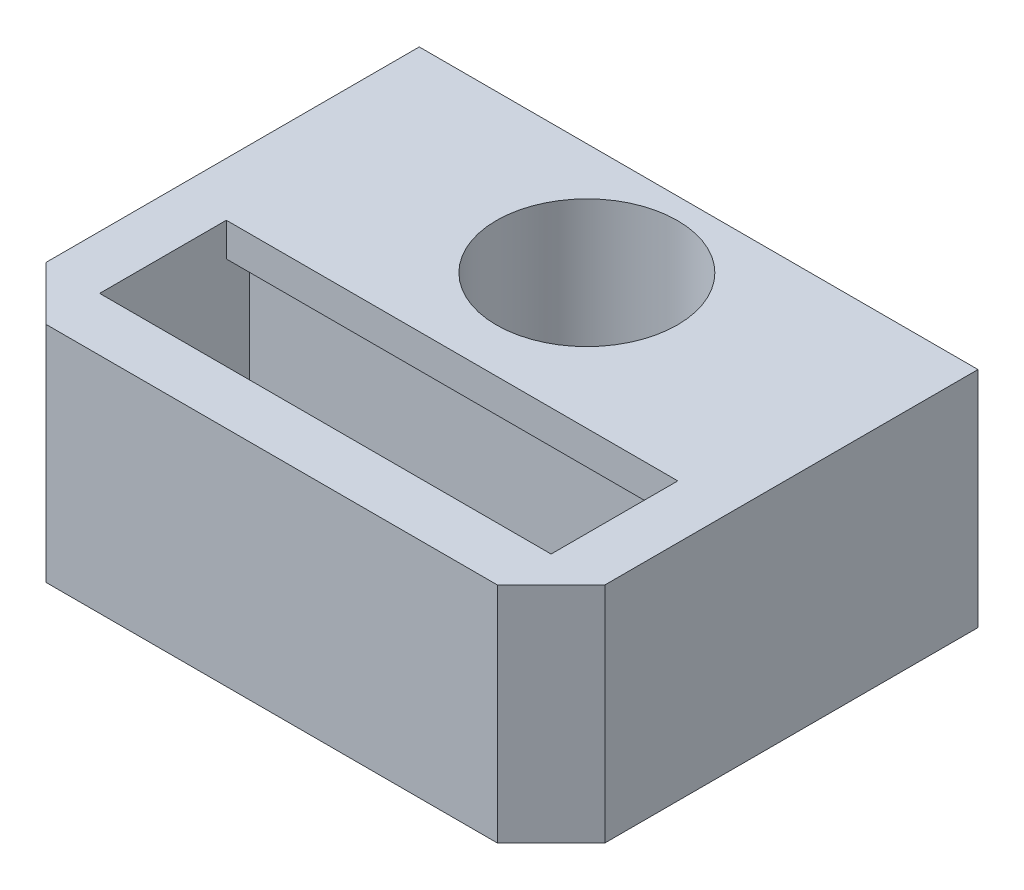
ISO-10303-21;
HEADER;
FILE_DESCRIPTION(('STEP AP214'),'2;1');
FILE_NAME('part.step','',(''),(''),'','','');
FILE_SCHEMA(('AUTOMOTIVE_DESIGN { 1 0 10303 214 1 1 1 1 }'));
ENDSEC;
DATA;
#1=APPLICATION_CONTEXT('core data for automotive mechanical design processes');
#2=APPLICATION_PROTOCOL_DEFINITION('international standard','automotive_design',2000,#1);
#3=PRODUCT_CONTEXT('',#1,'mechanical');
#4=PRODUCT('Part','Part','',(#3));
#5=PRODUCT_RELATED_PRODUCT_CATEGORY('part','',(#4));
#6=PRODUCT_DEFINITION_FORMATION('','',#4);
#7=PRODUCT_DEFINITION_CONTEXT('part definition',#1,'design');
#8=PRODUCT_DEFINITION('design','',#6,#7);
#9=PRODUCT_DEFINITION_SHAPE('','',#8);
#10=(LENGTH_UNIT() NAMED_UNIT(*) SI_UNIT(.MILLI.,.METRE.));
#11=(NAMED_UNIT(*) PLANE_ANGLE_UNIT() SI_UNIT($,.RADIAN.));
#12=(NAMED_UNIT(*) SI_UNIT($,.STERADIAN.) SOLID_ANGLE_UNIT());
#13=UNCERTAINTY_MEASURE_WITH_UNIT(LENGTH_MEASURE(1.E-05),#10,'distance_accuracy_value','');
#14=(GEOMETRIC_REPRESENTATION_CONTEXT(3) GLOBAL_UNCERTAINTY_ASSIGNED_CONTEXT((#13)) GLOBAL_UNIT_ASSIGNED_CONTEXT((#10,
#11,#12)) REPRESENTATION_CONTEXT('',''));
#15=CARTESIAN_POINT('',(0.,0.,0.));
#16=DIRECTION('',(0.,0.,1.));
#17=DIRECTION('',(1.,0.,0.));
#18=AXIS2_PLACEMENT_3D('',#15,#16,#17);
#19=CARTESIAN_POINT('',(0.,10.,0.));
#20=DIRECTION('',(0.,-1.,0.));
#21=DIRECTION('',(0.,0.,-1.));
#22=AXIS2_PLACEMENT_3D('',#19,#20,#21);
#23=PLANE('',#22);
#24=DIRECTION('',(-1.,0.,0.));
#25=VECTOR('',#24,1.);
#26=CARTESIAN_POINT('',(12.5,10.,6.03119465197785));
#27=LINE('',#26,#25);
#28=CARTESIAN_POINT('',(10.1,10.,6.03119465197785));
#29=VERTEX_POINT('',#28);
#30=CARTESIAN_POINT('',(-10.1,10.,6.03119465197785));
#31=VERTEX_POINT('',#30);
#32=EDGE_CURVE('E145',#29,#31,#27,.T.);
#33=ORIENTED_EDGE('',*,*,#32,.F.);
#34=DIRECTION('',(0.,0.,-1.));
#35=VECTOR('',#34,1.);
#36=CARTESIAN_POINT('',(10.1,10.,5.));
#37=LINE('',#36,#35);
#38=CARTESIAN_POINT('',(10.1,10.,11.7));
#39=VERTEX_POINT('',#38);
#40=EDGE_CURVE('E246',#39,#29,#37,.T.);
#41=ORIENTED_EDGE('',*,*,#40,.F.);
#42=DIRECTION('',(1.,0.,0.));
#43=VECTOR('',#42,1.);
#44=CARTESIAN_POINT('',(-10.1,10.,11.7));
#45=LINE('',#44,#43);
#46=CARTESIAN_POINT('',(-10.1,10.,11.7));
#47=VERTEX_POINT('',#46);
#48=EDGE_CURVE('E249',#47,#39,#45,.T.);
#49=ORIENTED_EDGE('',*,*,#48,.F.);
#50=DIRECTION('',(0.,0.,1.));
#51=VECTOR('',#50,1.);
#52=CARTESIAN_POINT('',(-10.1,10.,5.));
#53=LINE('',#52,#51);
#54=EDGE_CURVE('E216',#31,#47,#53,.T.);
#55=ORIENTED_EDGE('',*,*,#54,.F.);
#56=EDGE_LOOP('',(#33,#41,#49,#55));
#57=FACE_BOUND('',#56,.T.);
#58=DIRECTION('',(0.,0.,-1.));
#59=VECTOR('',#58,1.);
#60=CARTESIAN_POINT('',(12.5,10.,5.));
#61=LINE('',#60,#59);
#62=CARTESIAN_POINT('',(12.5,10.,11.7));
#63=VERTEX_POINT('',#62);
#64=CARTESIAN_POINT('',(12.5,10.,-5.));
#65=VERTEX_POINT('',#64);
#66=EDGE_CURVE('E165',#63,#65,#61,.T.);
#67=ORIENTED_EDGE('',*,*,#66,.T.);
#68=DIRECTION('',(-1.,0.,0.));
#69=VECTOR('',#68,1.);
#70=CARTESIAN_POINT('',(-12.5,10.,-5.));
#71=LINE('',#70,#69);
#72=CARTESIAN_POINT('',(-12.5,10.,-5.));
#73=VERTEX_POINT('',#72);
#74=EDGE_CURVE('E179',#65,#73,#71,.T.);
#75=ORIENTED_EDGE('',*,*,#74,.T.);
#76=DIRECTION('',(0.,0.,1.));
#77=VECTOR('',#76,1.);
#78=CARTESIAN_POINT('',(-12.5,10.,5.));
#79=LINE('',#78,#77);
#80=CARTESIAN_POINT('',(-12.5,10.,11.7));
#81=VERTEX_POINT('',#80);
#82=EDGE_CURVE('E161',#73,#81,#79,.T.);
#83=ORIENTED_EDGE('',*,*,#82,.T.);
#84=DIRECTION('',(-0.707106781186546,0.,-0.707106781186549));
#85=VECTOR('',#84,1.);
#86=CARTESIAN_POINT('',(-12.5,10.,11.7));
#87=LINE('',#86,#85);
#88=CARTESIAN_POINT('',(-10.1,10.,14.1));
#89=VERTEX_POINT('',#88);
#90=EDGE_CURVE('E137',#89,#81,#87,.T.);
#91=ORIENTED_EDGE('',*,*,#90,.F.);
#92=DIRECTION('',(-1.,0.,0.));
#93=VECTOR('',#92,1.);
#94=CARTESIAN_POINT('',(-10.1,10.,14.1));
#95=LINE('',#94,#93);
#96=CARTESIAN_POINT('',(10.1,10.,14.1));
#97=VERTEX_POINT('',#96);
#98=EDGE_CURVE('E238',#97,#89,#95,.T.);
#99=ORIENTED_EDGE('',*,*,#98,.F.);
#100=DIRECTION('',(-0.707106781186546,0.,0.707106781186549));
#101=VECTOR('',#100,1.);
#102=CARTESIAN_POINT('',(10.1,10.,14.1));
#103=LINE('',#102,#101);
#104=EDGE_CURVE('E242',#63,#97,#103,.T.);
#105=ORIENTED_EDGE('',*,*,#104,.F.);
#106=EDGE_LOOP('',(#67,#75,#83,#91,#99,#105));
#107=FACE_BOUND('',#106,.T.);
#108=CARTESIAN_POINT('',(0.,10.,0.));
#109=DIRECTION('',(0.,1.,0.));
#110=DIRECTION('',(0.,0.,1.));
#111=AXIS2_PLACEMENT_3D('',#108,#109,#110);
#112=CIRCLE('',#111,4.05);
#113=CARTESIAN_POINT('',(0.,10.,4.05));
#114=VERTEX_POINT('',#113);
#115=EDGE_CURVE('E176',#114,#114,#112,.T.);
#116=ORIENTED_EDGE('',*,*,#115,.F.);
#117=EDGE_LOOP('',(#116));
#118=FACE_BOUND('',#117,.T.);
#119=ADVANCED_FACE('F39',(#57,#107,#118),#23,.F.);
#120=CARTESIAN_POINT('',(0.,0.,0.));
#121=DIRECTION('',(0.,-1.,0.));
#122=DIRECTION('',(0.,0.,-1.));
#123=AXIS2_PLACEMENT_3D('',#120,#121,#122);
#124=PLANE('',#123);
#125=DIRECTION('',(0.,0.,-1.));
#126=VECTOR('',#125,1.);
#127=CARTESIAN_POINT('',(12.5,0.,5.));
#128=LINE('',#127,#126);
#129=CARTESIAN_POINT('',(12.5,0.,11.7));
#130=VERTEX_POINT('',#129);
#131=CARTESIAN_POINT('',(12.5,0.,-5.));
#132=VERTEX_POINT('',#131);
#133=EDGE_CURVE('E172',#130,#132,#128,.T.);
#134=ORIENTED_EDGE('',*,*,#133,.F.);
#135=DIRECTION('',(-0.707106781186546,0.,0.707106781186549));
#136=VECTOR('',#135,1.);
#137=CARTESIAN_POINT('',(10.1,0.,14.1));
#138=LINE('',#137,#136);
#139=CARTESIAN_POINT('',(10.1,0.,14.1));
#140=VERTEX_POINT('',#139);
#141=EDGE_CURVE('E221',#130,#140,#138,.T.);
#142=ORIENTED_EDGE('',*,*,#141,.T.);
#143=DIRECTION('',(-1.,0.,0.));
#144=VECTOR('',#143,1.);
#145=CARTESIAN_POINT('',(-10.1,0.,14.1));
#146=LINE('',#145,#144);
#147=CARTESIAN_POINT('',(-10.1,0.,14.1));
#148=VERTEX_POINT('',#147);
#149=EDGE_CURVE('E217',#140,#148,#146,.T.);
#150=ORIENTED_EDGE('',*,*,#149,.T.);
#151=DIRECTION('',(-0.707106781186546,0.,-0.707106781186549));
#152=VECTOR('',#151,1.);
#153=CARTESIAN_POINT('',(-12.5,0.,11.7));
#154=LINE('',#153,#152);
#155=CARTESIAN_POINT('',(-12.5,0.,11.7));
#156=VERTEX_POINT('',#155);
#157=EDGE_CURVE('E212',#148,#156,#154,.T.);
#158=ORIENTED_EDGE('',*,*,#157,.T.);
#159=DIRECTION('',(0.,0.,1.));
#160=VECTOR('',#159,1.);
#161=CARTESIAN_POINT('',(-12.5,0.,5.));
#162=LINE('',#161,#160);
#163=CARTESIAN_POINT('',(-12.5,0.,-5.));
#164=VERTEX_POINT('',#163);
#165=EDGE_CURVE('E166',#164,#156,#162,.T.);
#166=ORIENTED_EDGE('',*,*,#165,.F.);
#167=DIRECTION('',(-1.,0.,0.));
#168=VECTOR('',#167,1.);
#169=CARTESIAN_POINT('',(-12.5,0.,-5.));
#170=LINE('',#169,#168);
#171=EDGE_CURVE('E169',#132,#164,#170,.T.);
#172=ORIENTED_EDGE('',*,*,#171,.F.);
#173=EDGE_LOOP('',(#134,#142,#150,#158,#166,#172));
#174=FACE_BOUND('',#173,.T.);
#175=DIRECTION('',(0.,0.,-1.));
#176=VECTOR('',#175,1.);
#177=CARTESIAN_POINT('',(10.1,0.,5.));
#178=LINE('',#177,#176);
#179=CARTESIAN_POINT('',(10.1,0.,11.7));
#180=VERTEX_POINT('',#179);
#181=CARTESIAN_POINT('',(10.1,0.,5.));
#182=VERTEX_POINT('',#181);
#183=EDGE_CURVE('E225',#180,#182,#178,.T.);
#184=ORIENTED_EDGE('',*,*,#183,.T.);
#185=DIRECTION('',(1.,0.,0.));
#186=VECTOR('',#185,1.);
#187=CARTESIAN_POINT('',(-12.5,0.,5.));
#188=LINE('',#187,#186);
#189=CARTESIAN_POINT('',(-10.1,0.,5.));
#190=VERTEX_POINT('',#189);
#191=EDGE_CURVE('E162',#190,#182,#188,.T.);
#192=ORIENTED_EDGE('',*,*,#191,.F.);
#193=DIRECTION('',(0.,0.,1.));
#194=VECTOR('',#193,1.);
#195=CARTESIAN_POINT('',(-10.1,0.,5.));
#196=LINE('',#195,#194);
#197=CARTESIAN_POINT('',(-10.1,0.,11.7));
#198=VERTEX_POINT('',#197);
#199=EDGE_CURVE('E131',#190,#198,#196,.T.);
#200=ORIENTED_EDGE('',*,*,#199,.T.);
#201=DIRECTION('',(1.,0.,0.));
#202=VECTOR('',#201,1.);
#203=CARTESIAN_POINT('',(-10.1,0.,11.7));
#204=LINE('',#203,#202);
#205=EDGE_CURVE('E229',#198,#180,#204,.T.);
#206=ORIENTED_EDGE('',*,*,#205,.T.);
#207=EDGE_LOOP('',(#184,#192,#200,#206));
#208=FACE_BOUND('',#207,.T.);
#209=CARTESIAN_POINT('',(0.,0.,0.));
#210=DIRECTION('',(0.,1.,0.));
#211=DIRECTION('',(0.,0.,1.));
#212=AXIS2_PLACEMENT_3D('',#209,#210,#211);
#213=CIRCLE('',#212,4.05);
#214=CARTESIAN_POINT('',(0.,0.,4.05));
#215=VERTEX_POINT('',#214);
#216=EDGE_CURVE('E184',#215,#215,#213,.T.);
#217=ORIENTED_EDGE('',*,*,#216,.T.);
#218=EDGE_LOOP('',(#217));
#219=FACE_BOUND('',#218,.T.);
#220=ADVANCED_FACE('F277',(#174,#208,#219),#124,.T.);
#221=CARTESIAN_POINT('',(12.5,10.,5.));
#222=DIRECTION('',(-1.,0.,0.));
#223=DIRECTION('',(0.,0.,1.));
#224=AXIS2_PLACEMENT_3D('',#221,#222,#223);
#225=PLANE('',#224);
#226=DIRECTION('',(0.,-1.,0.));
#227=VECTOR('',#226,1.);
#228=CARTESIAN_POINT('',(12.5,10.,-5.));
#229=LINE('',#228,#227);
#230=EDGE_CURVE('E152',#65,#132,#229,.T.);
#231=ORIENTED_EDGE('',*,*,#230,.F.);
#232=ORIENTED_EDGE('',*,*,#66,.F.);
#233=DIRECTION('',(0.,-1.,0.));
#234=VECTOR('',#233,1.);
#235=CARTESIAN_POINT('',(12.5,10.,11.7));
#236=LINE('',#235,#234);
#237=EDGE_CURVE('E199',#63,#130,#236,.T.);
#238=ORIENTED_EDGE('',*,*,#237,.T.);
#239=ORIENTED_EDGE('',*,*,#133,.T.);
#240=EDGE_LOOP('',(#231,#232,#238,#239));
#241=FACE_BOUND('',#240,.T.);
#242=ADVANCED_FACE('F41',(#241),#225,.F.);
#243=CARTESIAN_POINT('',(-12.5,10.,-5.));
#244=DIRECTION('',(0.,0.,1.));
#245=DIRECTION('',(1.,0.,0.));
#246=AXIS2_PLACEMENT_3D('',#243,#244,#245);
#247=PLANE('',#246);
#248=ORIENTED_EDGE('',*,*,#171,.T.);
#249=DIRECTION('',(0.,-1.,0.));
#250=VECTOR('',#249,1.);
#251=CARTESIAN_POINT('',(-12.5,10.,-5.));
#252=LINE('',#251,#250);
#253=EDGE_CURVE('E155',#73,#164,#252,.T.);
#254=ORIENTED_EDGE('',*,*,#253,.F.);
#255=ORIENTED_EDGE('',*,*,#74,.F.);
#256=ORIENTED_EDGE('',*,*,#230,.T.);
#257=EDGE_LOOP('',(#248,#254,#255,#256));
#258=FACE_BOUND('',#257,.T.);
#259=ADVANCED_FACE('F306',(#258),#247,.F.);
#260=CARTESIAN_POINT('',(-12.5,10.,5.));
#261=DIRECTION('',(1.,0.,0.));
#262=DIRECTION('',(0.,0.,-1.));
#263=AXIS2_PLACEMENT_3D('',#260,#261,#262);
#264=PLANE('',#263);
#265=DIRECTION('',(0.,-1.,0.));
#266=VECTOR('',#265,1.);
#267=CARTESIAN_POINT('',(-12.5,10.,11.7));
#268=LINE('',#267,#266);
#269=EDGE_CURVE('E188',#81,#156,#268,.T.);
#270=ORIENTED_EDGE('',*,*,#269,.F.);
#271=ORIENTED_EDGE('',*,*,#82,.F.);
#272=ORIENTED_EDGE('',*,*,#253,.T.);
#273=ORIENTED_EDGE('',*,*,#165,.T.);
#274=EDGE_LOOP('',(#270,#271,#272,#273));
#275=FACE_BOUND('',#274,.T.);
#276=ADVANCED_FACE('F304',(#275),#264,.F.);
#277=CARTESIAN_POINT('',(-12.5,10.,5.));
#278=DIRECTION('',(0.,0.,-1.));
#279=DIRECTION('',(-1.,0.,0.));
#280=AXIS2_PLACEMENT_3D('',#277,#278,#279);
#281=PLANE('',#280);
#282=DIRECTION('',(0.,-1.,0.));
#283=VECTOR('',#282,1.);
#284=CARTESIAN_POINT('',(10.1,10.,5.));
#285=LINE('',#284,#283);
#286=CARTESIAN_POINT('',(10.1,8.5,5.));
#287=VERTEX_POINT('',#286);
#288=EDGE_CURVE('E142',#287,#182,#285,.T.);
#289=ORIENTED_EDGE('',*,*,#288,.F.);
#290=DIRECTION('',(-1.,0.,0.));
#291=VECTOR('',#290,1.);
#292=CARTESIAN_POINT('',(-12.5,8.5,5.));
#293=LINE('',#292,#291);
#294=CARTESIAN_POINT('',(-10.1,8.5,5.));
#295=VERTEX_POINT('',#294);
#296=EDGE_CURVE('E140',#287,#295,#293,.T.);
#297=ORIENTED_EDGE('',*,*,#296,.T.);
#298=DIRECTION('',(0.,-1.,0.));
#299=VECTOR('',#298,1.);
#300=CARTESIAN_POINT('',(-10.1,10.,5.));
#301=LINE('',#300,#299);
#302=EDGE_CURVE('E126',#295,#190,#301,.T.);
#303=ORIENTED_EDGE('',*,*,#302,.T.);
#304=ORIENTED_EDGE('',*,*,#191,.T.);
#305=EDGE_LOOP('',(#289,#297,#303,#304));
#306=FACE_BOUND('',#305,.T.);
#307=ADVANCED_FACE('F141',(#306),#281,.F.);
#308=CARTESIAN_POINT('',(0.,10.,0.));
#309=DIRECTION('',(0.,-1.,0.));
#310=DIRECTION('',(0.,0.,-1.));
#311=AXIS2_PLACEMENT_3D('',#308,#309,#310);
#312=CYLINDRICAL_SURFACE('',#311,4.05);
#313=ORIENTED_EDGE('',*,*,#115,.T.);
#314=EDGE_LOOP('',(#313));
#315=FACE_BOUND('',#314,.T.);
#316=ORIENTED_EDGE('',*,*,#216,.F.);
#317=EDGE_LOOP('',(#316));
#318=FACE_BOUND('',#317,.T.);
#319=ADVANCED_FACE('F299',(#315,#318),#312,.F.);
#320=CARTESIAN_POINT('',(-12.5,10.,11.7));
#321=DIRECTION('',(-0.707106781186549,0.,0.707106781186546));
#322=DIRECTION('',(0.707106781186546,0.,0.707106781186549));
#323=AXIS2_PLACEMENT_3D('',#320,#321,#322);
#324=PLANE('',#323);
#325=ORIENTED_EDGE('',*,*,#157,.F.);
#326=DIRECTION('',(0.,-1.,0.));
#327=VECTOR('',#326,1.);
#328=CARTESIAN_POINT('',(-10.1,10.,14.1));
#329=LINE('',#328,#327);
#330=EDGE_CURVE('E206',#89,#148,#329,.T.);
#331=ORIENTED_EDGE('',*,*,#330,.F.);
#332=ORIENTED_EDGE('',*,*,#90,.T.);
#333=ORIENTED_EDGE('',*,*,#269,.T.);
#334=EDGE_LOOP('',(#325,#331,#332,#333));
#335=FACE_BOUND('',#334,.T.);
#336=ADVANCED_FACE('F323',(#335),#324,.T.);
#337=CARTESIAN_POINT('',(-10.1,10.,14.1));
#338=DIRECTION('',(0.,0.,1.));
#339=DIRECTION('',(1.,0.,0.));
#340=AXIS2_PLACEMENT_3D('',#337,#338,#339);
#341=PLANE('',#340);
#342=ORIENTED_EDGE('',*,*,#149,.F.);
#343=DIRECTION('',(0.,-1.,0.));
#344=VECTOR('',#343,1.);
#345=CARTESIAN_POINT('',(10.1,10.,14.1));
#346=LINE('',#345,#344);
#347=EDGE_CURVE('E203',#97,#140,#346,.T.);
#348=ORIENTED_EDGE('',*,*,#347,.F.);
#349=ORIENTED_EDGE('',*,*,#98,.T.);
#350=ORIENTED_EDGE('',*,*,#330,.T.);
#351=EDGE_LOOP('',(#342,#348,#349,#350));
#352=FACE_BOUND('',#351,.T.);
#353=ADVANCED_FACE('F288',(#352),#341,.T.);
#354=CARTESIAN_POINT('',(10.1,10.,14.1));
#355=DIRECTION('',(0.707106781186549,0.,0.707106781186546));
#356=DIRECTION('',(0.707106781186546,0.,-0.707106781186549));
#357=AXIS2_PLACEMENT_3D('',#354,#355,#356);
#358=PLANE('',#357);
#359=ORIENTED_EDGE('',*,*,#141,.F.);
#360=ORIENTED_EDGE('',*,*,#237,.F.);
#361=ORIENTED_EDGE('',*,*,#104,.T.);
#362=ORIENTED_EDGE('',*,*,#347,.T.);
#363=EDGE_LOOP('',(#359,#360,#361,#362));
#364=FACE_BOUND('',#363,.T.);
#365=ADVANCED_FACE('F281',(#364),#358,.T.);
#366=CARTESIAN_POINT('',(10.1,10.,5.));
#367=DIRECTION('',(-1.,0.,0.));
#368=DIRECTION('',(0.,0.,1.));
#369=AXIS2_PLACEMENT_3D('',#366,#367,#368);
#370=PLANE('',#369);
#371=DIRECTION('',(0.,1.,0.));
#372=VECTOR('',#371,1.);
#373=CARTESIAN_POINT('',(10.1,10.,6.03119465197785));
#374=LINE('',#373,#372);
#375=CARTESIAN_POINT('',(10.1,8.5,6.03119465197785));
#376=VERTEX_POINT('',#375);
#377=EDGE_CURVE('E55',#376,#29,#374,.T.);
#378=ORIENTED_EDGE('',*,*,#377,.F.);
#379=DIRECTION('',(0.,0.,1.));
#380=VECTOR('',#379,1.);
#381=CARTESIAN_POINT('',(10.1,8.5,5.));
#382=LINE('',#381,#380);
#383=EDGE_CURVE('E59',#287,#376,#382,.T.);
#384=ORIENTED_EDGE('',*,*,#383,.F.);
#385=ORIENTED_EDGE('',*,*,#288,.T.);
#386=ORIENTED_EDGE('',*,*,#183,.F.);
#387=DIRECTION('',(0.,-1.,0.));
#388=VECTOR('',#387,1.);
#389=CARTESIAN_POINT('',(10.1,10.,11.7));
#390=LINE('',#389,#388);
#391=EDGE_CURVE('E194',#39,#180,#390,.T.);
#392=ORIENTED_EDGE('',*,*,#391,.F.);
#393=ORIENTED_EDGE('',*,*,#40,.T.);
#394=EDGE_LOOP('',(#378,#384,#385,#386,#392,#393));
#395=FACE_BOUND('',#394,.T.);
#396=ADVANCED_FACE('F279',(#395),#370,.T.);
#397=CARTESIAN_POINT('',(-10.1,10.,11.7));
#398=DIRECTION('',(0.,0.,-1.));
#399=DIRECTION('',(-1.,0.,0.));
#400=AXIS2_PLACEMENT_3D('',#397,#398,#399);
#401=PLANE('',#400);
#402=ORIENTED_EDGE('',*,*,#205,.F.);
#403=DIRECTION('',(0.,-1.,0.));
#404=VECTOR('',#403,1.);
#405=CARTESIAN_POINT('',(-10.1,10.,11.7));
#406=LINE('',#405,#404);
#407=EDGE_CURVE('E136',#47,#198,#406,.T.);
#408=ORIENTED_EDGE('',*,*,#407,.F.);
#409=ORIENTED_EDGE('',*,*,#48,.T.);
#410=ORIENTED_EDGE('',*,*,#391,.T.);
#411=EDGE_LOOP('',(#402,#408,#409,#410));
#412=FACE_BOUND('',#411,.T.);
#413=ADVANCED_FACE('F274',(#412),#401,.T.);
#414=CARTESIAN_POINT('',(-10.1,10.,5.));
#415=DIRECTION('',(1.,0.,0.));
#416=DIRECTION('',(0.,0.,-1.));
#417=AXIS2_PLACEMENT_3D('',#414,#415,#416);
#418=PLANE('',#417);
#419=DIRECTION('',(0.,-1.,0.));
#420=VECTOR('',#419,1.);
#421=CARTESIAN_POINT('',(-10.1,10.,6.03119465197785));
#422=LINE('',#421,#420);
#423=CARTESIAN_POINT('',(-10.1,8.5,6.03119465197785));
#424=VERTEX_POINT('',#423);
#425=EDGE_CURVE('E11',#31,#424,#422,.T.);
#426=ORIENTED_EDGE('',*,*,#425,.F.);
#427=ORIENTED_EDGE('',*,*,#54,.T.);
#428=ORIENTED_EDGE('',*,*,#407,.T.);
#429=ORIENTED_EDGE('',*,*,#199,.F.);
#430=ORIENTED_EDGE('',*,*,#302,.F.);
#431=DIRECTION('',(0.,0.,-1.));
#432=VECTOR('',#431,1.);
#433=CARTESIAN_POINT('',(-10.1,8.5,5.));
#434=LINE('',#433,#432);
#435=EDGE_CURVE('E48',#424,#295,#434,.T.);
#436=ORIENTED_EDGE('',*,*,#435,.F.);
#437=EDGE_LOOP('',(#426,#427,#428,#429,#430,#436));
#438=FACE_BOUND('',#437,.T.);
#439=ADVANCED_FACE('F128',(#438),#418,.T.);
#440=CARTESIAN_POINT('',(12.5,10.,6.03119465197785));
#441=DIRECTION('',(0.,0.,1.));
#442=DIRECTION('',(1.,0.,0.));
#443=AXIS2_PLACEMENT_3D('',#440,#441,#442);
#444=PLANE('',#443);
#445=DIRECTION('',(-1.,0.,0.));
#446=VECTOR('',#445,1.);
#447=CARTESIAN_POINT('',(12.5,8.5,6.03119465197785));
#448=LINE('',#447,#446);
#449=EDGE_CURVE('E150',#376,#424,#448,.T.);
#450=ORIENTED_EDGE('',*,*,#449,.F.);
#451=ORIENTED_EDGE('',*,*,#377,.T.);
#452=ORIENTED_EDGE('',*,*,#32,.T.);
#453=ORIENTED_EDGE('',*,*,#425,.T.);
#454=EDGE_LOOP('',(#450,#451,#452,#453));
#455=FACE_BOUND('',#454,.T.);
#456=ADVANCED_FACE('F265',(#455),#444,.T.);
#457=CARTESIAN_POINT('',(12.5,8.5,4.27879534541251));
#458=DIRECTION('',(0.,-1.,0.));
#459=DIRECTION('',(0.,0.,-1.));
#460=AXIS2_PLACEMENT_3D('',#457,#458,#459);
#461=PLANE('',#460);
#462=ORIENTED_EDGE('',*,*,#296,.F.);
#463=ORIENTED_EDGE('',*,*,#383,.T.);
#464=ORIENTED_EDGE('',*,*,#449,.T.);
#465=ORIENTED_EDGE('',*,*,#435,.T.);
#466=EDGE_LOOP('',(#462,#463,#464,#465));
#467=FACE_BOUND('',#466,.T.);
#468=ADVANCED_FACE('F148',(#467),#461,.T.);
#469=CLOSED_SHELL('',(#119,#220,#242,#259,#276,#307,#319,#336,#353,#365,#396,#413,#439,#456,#468));
#470=MANIFOLD_SOLID_BREP('B2',#469);
#471=ADVANCED_BREP_SHAPE_REPRESENTATION('',(#18,#470),#14);
#472=SHAPE_DEFINITION_REPRESENTATION(#9,#471);
ENDSEC;
END-ISO-10303-21;
